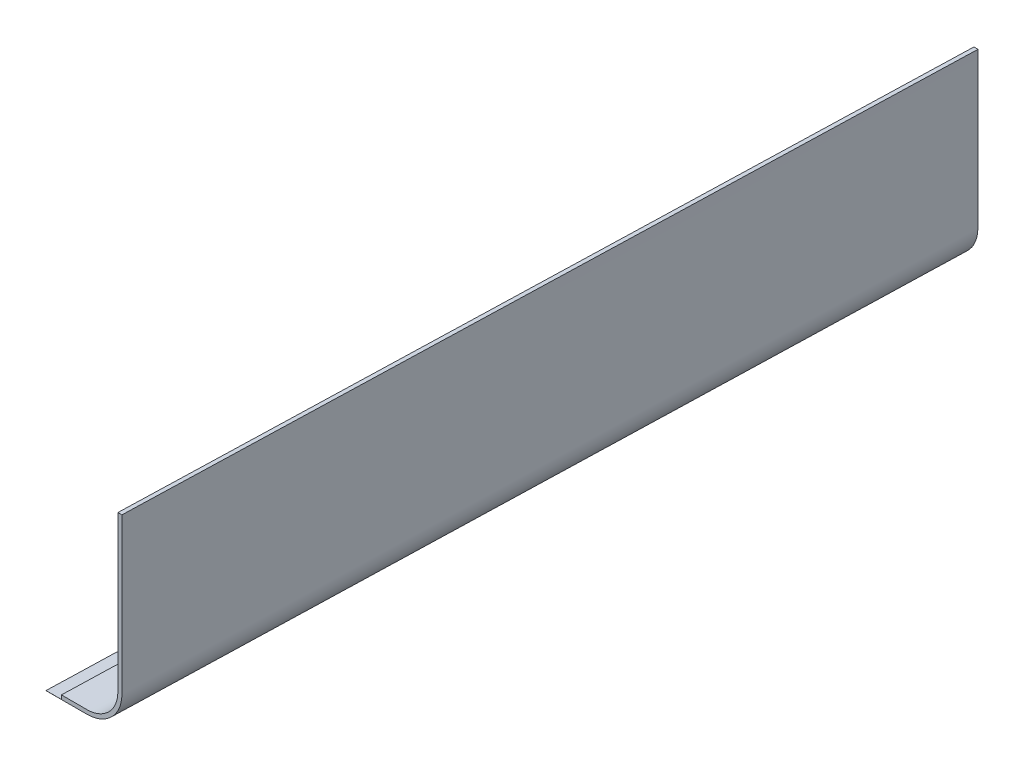
ISO-10303-21;
HEADER;
FILE_DESCRIPTION(('STEP AP214'),'2;1');
FILE_NAME('part.step','',(''),(''),'','','');
FILE_SCHEMA(('AUTOMOTIVE_DESIGN { 1 0 10303 214 1 1 1 1 }'));
ENDSEC;
DATA;
#1=APPLICATION_CONTEXT('core data for automotive mechanical design processes');
#2=APPLICATION_PROTOCOL_DEFINITION('international standard','automotive_design',2000,#1);
#3=PRODUCT_CONTEXT('',#1,'mechanical');
#4=PRODUCT('Part','Part','',(#3));
#5=PRODUCT_RELATED_PRODUCT_CATEGORY('part','',(#4));
#6=PRODUCT_DEFINITION_FORMATION('','',#4);
#7=PRODUCT_DEFINITION_CONTEXT('part definition',#1,'design');
#8=PRODUCT_DEFINITION('design','',#6,#7);
#9=PRODUCT_DEFINITION_SHAPE('','',#8);
#10=(LENGTH_UNIT() NAMED_UNIT(*) SI_UNIT(.MILLI.,.METRE.));
#11=(NAMED_UNIT(*) PLANE_ANGLE_UNIT() SI_UNIT($,.RADIAN.));
#12=(NAMED_UNIT(*) SI_UNIT($,.STERADIAN.) SOLID_ANGLE_UNIT());
#13=UNCERTAINTY_MEASURE_WITH_UNIT(LENGTH_MEASURE(1.E-05),#10,'distance_accuracy_value','');
#14=(GEOMETRIC_REPRESENTATION_CONTEXT(3) GLOBAL_UNCERTAINTY_ASSIGNED_CONTEXT((#13)) GLOBAL_UNIT_ASSIGNED_CONTEXT((#10,
#11,#12)) REPRESENTATION_CONTEXT('',''));
#15=CARTESIAN_POINT('',(0.,0.,0.));
#16=DIRECTION('',(0.,0.,1.));
#17=DIRECTION('',(1.,0.,0.));
#18=AXIS2_PLACEMENT_3D('',#15,#16,#17);
#19=CARTESIAN_POINT('',(444.552202442193,-229.69048438311,-2052.91158045471));
#20=DIRECTION('',(0.,0.,-1.));
#21=DIRECTION('',(-1.,0.,0.));
#22=AXIS2_PLACEMENT_3D('',#19,#20,#21);
#23=PLANE('',#22);
#24=CARTESIAN_POINT('',(444.552202442193,-229.69048438311,-2052.91158045471));
#25=DIRECTION('',(0.,0.,-1.));
#26=DIRECTION('',(-1.,0.,0.));
#27=AXIS2_PLACEMENT_3D('',#24,#25,#26);
#28=CIRCLE('',#27,76.2);
#29=CARTESIAN_POINT('',(520.752202442193,-229.69048438311,-2052.91158045471));
#30=VERTEX_POINT('',#29);
#31=CARTESIAN_POINT('',(444.552202442193,-305.89048438311,-2052.91158045471));
#32=VERTEX_POINT('',#31);
#33=EDGE_CURVE('E407',#30,#32,#28,.T.);
#34=ORIENTED_EDGE('',*,*,#33,.F.);
#35=DIRECTION('',(0.,1.,0.));
#36=VECTOR('',#35,1.);
#37=CARTESIAN_POINT('',(520.752202442193,-229.69048438311,-2052.91158045471));
#38=LINE('',#37,#36);
#39=CARTESIAN_POINT('',(520.775302184779,119.559497264368,-2052.91158045471));
#40=VERTEX_POINT('',#39);
#41=EDGE_CURVE('E13',#30,#40,#38,.T.);
#42=ORIENTED_EDGE('',*,*,#41,.T.);
#43=DIRECTION('',(0.00914316205582928,0.999958200420208,0.));
#44=VECTOR('',#43,1.);
#45=CARTESIAN_POINT('',(520.752202442193,119.55951561689,-2052.91158045471));
#46=LINE('',#45,#44);
#47=CARTESIAN_POINT('',(521.055748406601,152.757360570469,-2052.91158045471));
#48=VERTEX_POINT('',#47);
#49=EDGE_CURVE('E296',#40,#48,#46,.T.);
#50=ORIENTED_EDGE('',*,*,#49,.T.);
#51=DIRECTION('',(0.999958200420208,-0.00914316205583025,0.));
#52=VECTOR('',#51,1.);
#53=CARTESIAN_POINT('',(521.055748406601,152.757360570469,-2052.91158045471));
#54=LINE('',#53,#52);
#55=CARTESIAN_POINT('',(531.055330410803,152.665928949911,-2052.91158045471));
#56=VERTEX_POINT('',#55);
#57=EDGE_CURVE('E728',#48,#56,#54,.T.);
#58=ORIENTED_EDGE('',*,*,#57,.T.);
#59=DIRECTION('',(0.00914316205582929,0.999958200420208,0.));
#60=VECTOR('',#59,1.);
#61=CARTESIAN_POINT('',(530.752202442193,119.513798851146,-2052.91158045471));
#62=LINE('',#61,#60);
#63=CARTESIAN_POINT('',(530.775272871336,119.513780556922,-2052.91158045471));
#64=VERTEX_POINT('',#63);
#65=EDGE_CURVE('E405',#64,#56,#62,.T.);
#66=ORIENTED_EDGE('',*,*,#65,.F.);
#67=DIRECTION('',(0.,1.,0.));
#68=VECTOR('',#67,1.);
#69=CARTESIAN_POINT('',(530.752202442193,-229.69048438311,-2052.91158045471));
#70=LINE('',#69,#68);
#71=CARTESIAN_POINT('',(530.752202442193,-229.69048438311,-2052.91158045471));
#72=VERTEX_POINT('',#71);
#73=EDGE_CURVE('E723',#72,#64,#70,.T.);
#74=ORIENTED_EDGE('',*,*,#73,.F.);
#75=CARTESIAN_POINT('',(444.552202442193,-229.69048438311,-2052.91158045471));
#76=DIRECTION('',(0.,0.,-1.));
#77=DIRECTION('',(-1.,0.,0.));
#78=AXIS2_PLACEMENT_3D('',#75,#76,#77);
#79=CIRCLE('',#78,86.2000000000001);
#80=CARTESIAN_POINT('',(444.552202442193,-315.89048438311,-2052.91158045471));
#81=VERTEX_POINT('',#80);
#82=EDGE_CURVE('E720',#72,#81,#79,.T.);
#83=ORIENTED_EDGE('',*,*,#82,.T.);
#84=DIRECTION('',(1.,0.,0.));
#85=VECTOR('',#84,1.);
#86=CARTESIAN_POINT('',(343.440050678528,-315.89048438311,-2052.91158045471));
#87=LINE('',#86,#85);
#88=CARTESIAN_POINT('',(343.440050678528,-315.89048438311,-2052.91158045471));
#89=VERTEX_POINT('',#88);
#90=EDGE_CURVE('E488',#89,#81,#87,.T.);
#91=ORIENTED_EDGE('',*,*,#90,.F.);
#92=DIRECTION('',(0.,1.,0.));
#93=VECTOR('',#92,1.);
#94=CARTESIAN_POINT('',(343.440050678528,-315.89048438311,-2052.91158045471));
#95=LINE('',#94,#93);
#96=CARTESIAN_POINT('',(343.440050678528,-315.69048438311,-2052.91158045471));
#97=VERTEX_POINT('',#96);
#98=EDGE_CURVE('E715',#89,#97,#95,.T.);
#99=ORIENTED_EDGE('',*,*,#98,.T.);
#100=DIRECTION('',(1.,0.,0.));
#101=VECTOR('',#100,1.);
#102=CARTESIAN_POINT('',(343.440050678528,-315.69048438311,-2052.91158045471));
#103=LINE('',#102,#101);
#104=CARTESIAN_POINT('',(381.540050678528,-315.69048438311,-2052.91158045471));
#105=VERTEX_POINT('',#104);
#106=EDGE_CURVE('E712',#97,#105,#103,.T.);
#107=ORIENTED_EDGE('',*,*,#106,.T.);
#108=DIRECTION('',(0.,-1.,0.));
#109=VECTOR('',#108,1.);
#110=CARTESIAN_POINT('',(381.540050678528,-305.89048438311,-2052.91158045471));
#111=LINE('',#110,#109);
#112=CARTESIAN_POINT('',(381.540050678528,-305.89048438311,-2052.91158045471));
#113=VERTEX_POINT('',#112);
#114=EDGE_CURVE('E310',#113,#105,#111,.T.);
#115=ORIENTED_EDGE('',*,*,#114,.F.);
#116=DIRECTION('',(1.,0.,0.));
#117=VECTOR('',#116,1.);
#118=CARTESIAN_POINT('',(381.540050678528,-305.89048438311,-2052.91158045471));
#119=LINE('',#118,#117);
#120=EDGE_CURVE('E304',#113,#32,#119,.T.);
#121=ORIENTED_EDGE('',*,*,#120,.T.);
#122=EDGE_LOOP('',(#34,#42,#50,#58,#66,#74,#83,#91,#99,#107,#115,#121));
#123=FACE_BOUND('',#122,.T.);
#124=ADVANCED_FACE('F285',(#123),#23,.T.);
#125=CARTESIAN_POINT('',(383.521789204401,-230.782639429518,0.));
#126=DIRECTION('',(0.,0.,1.));
#127=DIRECTION('',(1.,0.,0.));
#128=AXIS2_PLACEMENT_3D('',#125,#126,#127);
#129=PLANE('',#128);
#130=DIRECTION('',(1.,0.,0.));
#131=VECTOR('',#130,1.);
#132=CARTESIAN_POINT('',(459.721789204401,152.757360570421,0.));
#133=LINE('',#132,#131);
#134=CARTESIAN_POINT('',(459.721789204401,152.757360570421,0.));
#135=VERTEX_POINT('',#134);
#136=CARTESIAN_POINT('',(469.721789204401,152.757360570421,0.));
#137=VERTEX_POINT('',#136);
#138=EDGE_CURVE('E379',#135,#137,#133,.T.);
#139=ORIENTED_EDGE('',*,*,#138,.F.);
#140=DIRECTION('',(0.,-1.,0.));
#141=VECTOR('',#140,1.);
#142=CARTESIAN_POINT('',(459.721789204401,152.757360570421,0.));
#143=LINE('',#142,#141);
#144=CARTESIAN_POINT('',(459.721789204401,-230.782639429518,0.));
#145=VERTEX_POINT('',#144);
#146=EDGE_CURVE('E521',#135,#145,#143,.T.);
#147=ORIENTED_EDGE('',*,*,#146,.T.);
#148=CARTESIAN_POINT('',(383.521789204401,-230.782639429518,0.));
#149=DIRECTION('',(0.,0.,1.));
#150=DIRECTION('',(1.,0.,0.));
#151=AXIS2_PLACEMENT_3D('',#148,#149,#150);
#152=CIRCLE('',#151,76.2);
#153=CARTESIAN_POINT('',(383.521789204401,-306.982639429518,0.));
#154=VERTEX_POINT('',#153);
#155=EDGE_CURVE('E525',#154,#145,#152,.T.);
#156=ORIENTED_EDGE('',*,*,#155,.F.);
#157=DIRECTION('',(1.,0.,0.));
#158=VECTOR('',#157,1.);
#159=CARTESIAN_POINT('',(320.329495069525,-306.982639429518,0.));
#160=LINE('',#159,#158);
#161=CARTESIAN_POINT('',(320.329495069525,-306.982639429518,0.));
#162=VERTEX_POINT('',#161);
#163=EDGE_CURVE('E543',#162,#154,#160,.T.);
#164=ORIENTED_EDGE('',*,*,#163,.F.);
#165=DIRECTION('',(0.,1.,0.));
#166=VECTOR('',#165,1.);
#167=CARTESIAN_POINT('',(320.329495069525,-316.782639429518,0.));
#168=LINE('',#167,#166);
#169=CARTESIAN_POINT('',(320.329495069525,-316.782639429518,0.));
#170=VERTEX_POINT('',#169);
#171=EDGE_CURVE('E546',#170,#162,#168,.T.);
#172=ORIENTED_EDGE('',*,*,#171,.F.);
#173=DIRECTION('',(1.,0.,0.));
#174=VECTOR('',#173,1.);
#175=CARTESIAN_POINT('',(282.229495069525,-316.782639429518,0.));
#176=LINE('',#175,#174);
#177=CARTESIAN_POINT('',(282.229495069525,-316.782639429518,0.));
#178=VERTEX_POINT('',#177);
#179=EDGE_CURVE('E564',#178,#170,#176,.T.);
#180=ORIENTED_EDGE('',*,*,#179,.F.);
#181=DIRECTION('',(0.,1.,0.));
#182=VECTOR('',#181,1.);
#183=CARTESIAN_POINT('',(282.229495069525,-316.982639429518,0.));
#184=LINE('',#183,#182);
#185=CARTESIAN_POINT('',(282.229495069525,-316.982639429518,0.));
#186=VERTEX_POINT('',#185);
#187=EDGE_CURVE('E567',#186,#178,#184,.T.);
#188=ORIENTED_EDGE('',*,*,#187,.F.);
#189=DIRECTION('',(-1.,0.,0.));
#190=VECTOR('',#189,1.);
#191=CARTESIAN_POINT('',(320.329495069525,-316.982639429518,0.));
#192=LINE('',#191,#190);
#193=CARTESIAN_POINT('',(320.329495069525,-316.982639429518,0.));
#194=VERTEX_POINT('',#193);
#195=EDGE_CURVE('E585',#194,#186,#192,.T.);
#196=ORIENTED_EDGE('',*,*,#195,.F.);
#197=DIRECTION('',(1.,0.,0.));
#198=VECTOR('',#197,1.);
#199=CARTESIAN_POINT('',(320.329495069525,-316.982639429518,0.));
#200=LINE('',#199,#198);
#201=CARTESIAN_POINT('',(383.521789204401,-316.982639429518,0.));
#202=VERTEX_POINT('',#201);
#203=EDGE_CURVE('E588',#194,#202,#200,.T.);
#204=ORIENTED_EDGE('',*,*,#203,.T.);
#205=CARTESIAN_POINT('',(383.521789204401,-230.782639429518,0.));
#206=DIRECTION('',(0.,0.,1.));
#207=DIRECTION('',(1.,0.,0.));
#208=AXIS2_PLACEMENT_3D('',#205,#206,#207);
#209=CIRCLE('',#208,86.2);
#210=CARTESIAN_POINT('',(469.721789204401,-230.782639429518,0.));
#211=VERTEX_POINT('',#210);
#212=EDGE_CURVE('E382',#202,#211,#209,.T.);
#213=ORIENTED_EDGE('',*,*,#212,.T.);
#214=DIRECTION('',(0.,-1.,0.));
#215=VECTOR('',#214,1.);
#216=CARTESIAN_POINT('',(469.721789204401,152.757360570421,0.));
#217=LINE('',#216,#215);
#218=EDGE_CURVE('E375',#137,#211,#217,.T.);
#219=ORIENTED_EDGE('',*,*,#218,.F.);
#220=EDGE_LOOP('',(#139,#147,#156,#164,#172,#180,#188,#196,#204,#213,#219));
#221=FACE_BOUND('',#220,.T.);
#222=ADVANCED_FACE('F378',(#221),#129,.T.);
#223=CARTESIAN_POINT('',(459.721789204401,152.757360570421,0.));
#224=CARTESIAN_POINT('',(480.166442271801,152.757360570437,-684.303860151571));
#225=CARTESIAN_POINT('',(500.611095339201,152.757360570453,-1368.60772030314));
#226=CARTESIAN_POINT('',(521.055748406601,152.757360570469,-2052.91158045471));
#227=CARTESIAN_POINT('',(460.555122537734,152.75736057042,0.));
#228=CARTESIAN_POINT('',(480.99976399414,152.754820803199,-684.303860151571));
#229=CARTESIAN_POINT('',(501.444405450546,152.752281035977,-1368.60772030314));
#230=CARTESIAN_POINT('',(521.889046906951,152.749741268756,-2052.91158045471));
#231=CARTESIAN_POINT('',(462.221789204401,152.757360570421,0.));
#232=CARTESIAN_POINT('',(482.666407438818,152.749741268724,-684.303860151571));
#233=CARTESIAN_POINT('',(503.111025673235,152.742121967027,-1368.60772030314));
#234=CARTESIAN_POINT('',(523.555643907652,152.73450266533,-2052.91158045471));
#235=CARTESIAN_POINT('',(464.721789204401,152.75736057042,0.));
#236=CARTESIAN_POINT('',(485.166372605835,152.74212196701,-684.303860151571));
#237=CARTESIAN_POINT('',(505.610956007268,152.7268833636,-1368.60772030314));
#238=CARTESIAN_POINT('',(526.055539408702,152.71164476019,-2052.91158045471));
#239=CARTESIAN_POINT('',(467.221789204401,152.757360570421,0.));
#240=CARTESIAN_POINT('',(487.666337772852,152.734502665297,-684.303860151571));
#241=CARTESIAN_POINT('',(508.110886341302,152.711644760174,-1368.60772030314));
#242=CARTESIAN_POINT('',(528.555434909753,152.68878685505,-2052.91158045471));
#243=CARTESIAN_POINT('',(468.888455871068,152.75736057042,0.));
#244=CARTESIAN_POINT('',(489.33298121753,152.729423130822,-684.303860151571));
#245=CARTESIAN_POINT('',(509.777506563991,152.701485691223,-1368.60772030314));
#246=CARTESIAN_POINT('',(530.222031910453,152.673548251624,-2052.91158045471));
#247=CARTESIAN_POINT('',(469.721789204401,152.757360570421,0.));
#248=CARTESIAN_POINT('',(490.166302939869,152.726883363584,-684.303860151571));
#249=CARTESIAN_POINT('',(510.610816675336,152.696406156747,-1368.60772030314));
#250=CARTESIAN_POINT('',(531.055330410803,152.665928949911,-2052.91158045471));
#251=B_SPLINE_SURFACE_WITH_KNOTS('',3,3,((#223,#224,#225,#226),(#227,#228,#229,#230),(#231,#232,
#233,#234),(#235,#236,#237,#238),(#239,#240,#241,#242),(#243,#244,#245,#246),(#247,#248,#249,
#250)),.UNSPECIFIED.,.F.,.F.,.F.,(4,1,1,1,4),(4,4),(0.99195781967235,0.993968364754263,
0.995978909836175,0.997989454918088,1.),(0.,1.),.UNSPECIFIED.);
#252=CARTESIAN_POINT('',(469.721789204401,152.757360570421,0.));
#253=CARTESIAN_POINT('',(490.166302939869,152.726883363584,-684.303860151571));
#254=CARTESIAN_POINT('',(510.610816675336,152.696406156747,-1368.60772030314));
#255=CARTESIAN_POINT('',(531.055330410803,152.665928949911,-2052.91158045471));
#256=B_SPLINE_CURVE_WITH_KNOTS('',3,(#252,#253,#254,#255),.UNSPECIFIED.,.F.,.F.,(4,4),(0.,1.),.UNSPECIFIED.);
#257=EDGE_CURVE('E395',#137,#56,#256,.T.);
#258=CARTESIAN_POINT('',(459.721789204401,152.757360570421,0.));
#259=CARTESIAN_POINT('',(480.166442271801,152.757360570437,-684.303860151571));
#260=CARTESIAN_POINT('',(500.611095339201,152.757360570453,-1368.60772030314));
#261=CARTESIAN_POINT('',(521.055748406601,152.757360570469,-2052.91158045471));
#262=B_SPLINE_CURVE_WITH_KNOTS('',3,(#258,#259,#260,#261),.UNSPECIFIED.,.F.,.F.,(4,4),(0.,1.),.UNSPECIFIED.);
#263=EDGE_CURVE('E397',#135,#48,#262,.T.);
#264=ORIENTED_EDGE('',*,*,#138,.T.);
#265=ORIENTED_EDGE('',*,*,#257,.T.);
#266=ORIENTED_EDGE('',*,*,#57,.F.);
#267=ORIENTED_EDGE('',*,*,#263,.F.);
#268=EDGE_LOOP('',(#264,#265,#266,#267));
#269=FACE_BOUND('',#268,.T.);
#270=ADVANCED_FACE('F393',(#269),#251,.T.);
#271=CARTESIAN_POINT('',(320.329495069525,-306.982639429518,0.));
#272=CARTESIAN_POINT('',(340.733013605859,-306.618587747382,-684.303860151571));
#273=CARTESIAN_POINT('',(361.136532142194,-306.254536065246,-1368.60772030314));
#274=CARTESIAN_POINT('',(381.540050678528,-305.89048438311,-2052.91158045471));
#275=CARTESIAN_POINT('',(325.550678712464,-306.982639429518,0.));
#276=CARTESIAN_POINT('',(345.979055586448,-306.618587747382,-684.303860151571));
#277=CARTESIAN_POINT('',(366.407432460432,-306.254536065246,-1368.60772030314));
#278=CARTESIAN_POINT('',(386.835809334416,-305.89048438311,-2052.91158045471));
#279=CARTESIAN_POINT('',(336.039639117235,-306.982639429518,0.));
#280=CARTESIAN_POINT('',(356.486233632602,-306.618587747382,-684.303860151571));
#281=CARTESIAN_POINT('',(376.93282814797,-306.254536065246,-1368.60772030314));
#282=CARTESIAN_POINT('',(397.379422663338,-305.89048438311,-2052.91158045471));
#283=CARTESIAN_POINT('',(351.85991993826,-306.982639429518,0.));
#284=CARTESIAN_POINT('',(372.276623963665,-306.618587747382,-684.303860151571));
#285=CARTESIAN_POINT('',(392.693327989069,-306.254536065246,-1368.60772030314));
#286=CARTESIAN_POINT('',(413.110032014474,-305.890484383109,-2052.91158045471));
#287=CARTESIAN_POINT('',(367.710949607846,-306.982639429518,0.));
#288=CARTESIAN_POINT('',(388.07781173544,-306.618587747382,-684.303860151571));
#289=CARTESIAN_POINT('',(408.444673863035,-306.254536065246,-1368.60772030314));
#290=CARTESIAN_POINT('',(428.81153599063,-305.89048438311,-2052.91158045471));
#291=CARTESIAN_POINT('',(378.260684754143,-306.982639429518,0.));
#292=CARTESIAN_POINT('',(398.605883216917,-306.618587747382,-684.303860151571));
#293=CARTESIAN_POINT('',(418.951081679692,-306.254536065246,-1368.60772030314));
#294=CARTESIAN_POINT('',(439.296280142466,-305.89048438311,-2052.91158045471));
#295=CARTESIAN_POINT('',(388.511527539999,-306.982639429518,0.));
#296=CARTESIAN_POINT('',(408.853360333651,-306.618587747382,-684.303860151571));
#297=CARTESIAN_POINT('',(429.195193127303,-306.254536065246,-1368.60772030314));
#298=CARTESIAN_POINT('',(449.537025920955,-305.89048438311,-2052.91158045471));
#299=CARTESIAN_POINT('',(398.488288635919,-305.99960007623,0.));
#300=CARTESIAN_POINT('',(418.82857298511,-305.636164400267,-684.303860151572));
#301=CARTESIAN_POINT('',(439.168857334301,-305.272728724305,-1368.60772030314));
#302=CARTESIAN_POINT('',(459.509141683492,-304.909293048342,-2052.91158045472));
#303=CARTESIAN_POINT('',(412.872903106114,-301.634794773295,0.));
#304=CARTESIAN_POINT('',(433.214645151296,-301.271648709871,-684.303860151571));
#305=CARTESIAN_POINT('',(453.556387196479,-300.908502646447,-1368.60772030314));
#306=CARTESIAN_POINT('',(473.898129241661,-300.545356583022,-2052.91158045471));
#307=CARTESIAN_POINT('',(426.127053955248,-294.550170818105,0.));
#308=CARTESIAN_POINT('',(446.47197693143,-294.185475641663,-684.303860151571));
#309=CARTESIAN_POINT('',(466.816899907611,-293.820780465222,-1368.60772030314));
#310=CARTESIAN_POINT('',(487.161822883793,-293.45608528878,-2052.91158045471));
#311=CARTESIAN_POINT('',(437.744292886715,-285.017487182193,0.));
#312=CARTESIAN_POINT('',(458.092075778492,-284.649510253963,-684.303860151571));
#313=CARTESIAN_POINT('',(478.439858670269,-284.281533325734,-1368.60772030314));
#314=CARTESIAN_POINT('',(498.787641562046,-283.913556397505,-2052.91158045471));
#315=CARTESIAN_POINT('',(447.280329472288,-273.401609659785,0.));
#316=CARTESIAN_POINT('',(467.629155039194,-273.029865002327,-684.30386015157));
#317=CARTESIAN_POINT('',(487.977980606101,-272.658120344868,-1368.60772030314));
#318=CARTESIAN_POINT('',(508.326806173008,-272.28637568741,-2052.91158045471));
#319=CARTESIAN_POINT('',(454.36915331995,-260.14604578772,0.));
#320=CARTESIAN_POINT('',(474.716724075819,-259.772066372182,-684.303860151573));
#321=CARTESIAN_POINT('',(495.064294831687,-259.398086956643,-1368.60772030315));
#322=CARTESIAN_POINT('',(515.411865587555,-259.024107541105,-2052.91158045472));
#323=CARTESIAN_POINT('',(458.737629648789,-245.756921325098,0.));
#324=CARTESIAN_POINT('',(479.082462362654,-245.384496388962,-684.30386015157));
#325=CARTESIAN_POINT('',(499.42729507652,-245.012071452827,-1368.60772030314));
#326=CARTESIAN_POINT('',(519.772127790385,-244.639646516691,-2052.91158045471));
#327=CARTESIAN_POINT('',(459.721789204401,-235.775214440323,0.));
#328=CARTESIAN_POINT('',(480.065260283665,-235.407635356068,-684.303860151571));
#329=CARTESIAN_POINT('',(500.408731362929,-235.040056271814,-1368.60772030314));
#330=CARTESIAN_POINT('',(520.752202442193,-234.672477187559,-2052.91158045471));
#331=CARTESIAN_POINT('',(459.721789204401,-201.606059407567,0.));
#332=CARTESIAN_POINT('',(480.065260283665,-201.262621843387,-684.303860151571));
#333=CARTESIAN_POINT('',(500.408731362929,-200.919184279206,-1368.60772030314));
#334=CARTESIAN_POINT('',(520.752202442193,-200.575746715026,-2052.91158045471));
#335=CARTESIAN_POINT('',(459.721789204401,-143.242312622474,0.));
#336=CARTESIAN_POINT('',(480.065260283665,-142.947158094973,-684.303860151571));
#337=CARTESIAN_POINT('',(500.408731362929,-142.652003567472,-1368.60772030314));
#338=CARTESIAN_POINT('',(520.752202442193,-142.356849039971,-2052.91158045471));
#339=CARTESIAN_POINT('',(459.721789204401,-55.6768216910397,0.));
#340=CARTESIAN_POINT('',(480.065260283665,-55.467319478478,-684.303860151571));
#341=CARTESIAN_POINT('',(500.408731362929,-55.2578172659163,-1368.60772030314));
#342=CARTESIAN_POINT('',(520.752202442192,-55.0483150533547,-2052.91158045471));
#343=CARTESIAN_POINT('',(459.721789204401,31.8966223620084,0.));
#344=CARTESIAN_POINT('',(480.065260283665,32.015181147921,-684.303860151571));
#345=CARTESIAN_POINT('',(500.408731362929,32.1337399338337,-1368.60772030314));
#346=CARTESIAN_POINT('',(520.752202442193,32.2522987197463,-2052.91158045471));
#347=CARTESIAN_POINT('',(459.721789204401,90.2762683376779,0.));
#348=CARTESIAN_POINT('',(480.065260283665,90.3359618751932,-684.303860151571));
#349=CARTESIAN_POINT('',(500.408731362929,90.3956554127084,-1368.60772030314));
#350=CARTESIAN_POINT('',(520.752202442193,90.4553489502237,-2052.91158045471));
#351=CARTESIAN_POINT('',(459.721789204401,122.237935004339,0.));
#352=CARTESIAN_POINT('',(480.07369211601,122.267290901678,-684.303860151571));
#353=CARTESIAN_POINT('',(500.425595027618,122.296646799017,-1368.60772030314));
#354=CARTESIAN_POINT('',(520.777497939227,122.326002696355,-2052.91158045471));
#355=CARTESIAN_POINT('',(459.721789204402,127.787378277302,0.));
#356=CARTESIAN_POINT('',(480.090554392569,127.811092654613,-684.30386015157));
#357=CARTESIAN_POINT('',(500.459319580736,127.834807031924,-1368.60772030314));
#358=CARTESIAN_POINT('',(520.828084768903,127.858521409235,-2052.91158045471));
#359=CARTESIAN_POINT('',(459.721789204401,136.111885850788,0.));
#360=CARTESIAN_POINT('',(480.115846766489,136.126909884864,-684.303860151572));
#361=CARTESIAN_POINT('',(500.509904328577,136.141933918939,-1368.60772030314));
#362=CARTESIAN_POINT('',(520.903961890666,136.156957953015,-2052.91158045472));
#363=CARTESIAN_POINT('',(459.721789204402,144.435707866162,0.));
#364=CARTESIAN_POINT('',(480.141141221547,144.44249768366,-684.30386015157));
#365=CARTESIAN_POINT('',(500.560493238693,144.449287501157,-1368.60772030314));
#366=CARTESIAN_POINT('',(520.979845255839,144.456077318655,-2052.91158045471));
#367=CARTESIAN_POINT('',(459.721789204401,149.983780574189,0.));
#368=CARTESIAN_POINT('',(480.158007662053,149.985841124116,-684.303860151571));
#369=CARTESIAN_POINT('',(500.594226119705,149.987901674044,-1368.60772030314));
#370=CARTESIAN_POINT('',(521.030444577357,149.989962223971,-2052.91158045471));
#371=CARTESIAN_POINT('',(459.721789204401,152.757360570421,0.));
#372=CARTESIAN_POINT('',(480.166442271801,152.757360570437,-684.303860151571));
#373=CARTESIAN_POINT('',(500.611095339201,152.757360570453,-1368.60772030314));
#374=CARTESIAN_POINT('',(521.055748406601,152.757360570469,-2052.91158045471));
#375=B_SPLINE_SURFACE_WITH_KNOTS('',3,3,((#271,#272,#273,#274),(#275,#276,#277,#278),(#279,#280,
#281,#282),(#283,#284,#285,#286),(#287,#288,#289,#290),(#291,#292,#293,#294),(#295,#296,#297,
#298),(#299,#300,#301,#302),(#303,#304,#305,#306),(#307,#308,#309,#310),(#311,#312,#313,#314),
(#315,#316,#317,#318),(#319,#320,#321,#322),(#323,#324,#325,#326),(#327,#328,#329,#330),(#331,
#332,#333,#334),(#335,#336,#337,#338),(#339,#340,#341,#342),(#343,#344,#345,#346),(#347,#348,
#349,#350),(#351,#352,#353,#354),(#355,#356,#357,#358),(#359,#360,#361,#362),(#363,#364,#365,
#366),(#367,#368,#369,#370),(#371,#372,#373,#374)),.UNSPECIFIED.,.F.,.F.,.F.,(4,1,1,1,2,1,1,1,1,
1,1,1,2,1,1,1,2,1,1,1,4),(4,4),(0.536938618118648,0.549625585344477,0.562312552570307,
0.574999519796136,0.587686487021966,0.599719064542451,0.611751642062935,0.62378421958342,
0.635816797103904,0.647849374624389,0.659881952144874,0.671914529665358,0.683947107185843,
0.754265421453073,0.824583735720304,0.894902049987534,0.965220364254765,0.971904728109161,
0.978589091963558,0.985273455817954,0.99195781967235),(0.,1.),.UNSPECIFIED.);
#376=CARTESIAN_POINT('',(320.329495069525,-306.982639429518,0.));
#377=CARTESIAN_POINT('',(340.733013605859,-306.618587747382,-684.303860151571));
#378=CARTESIAN_POINT('',(361.136532142194,-306.254536065246,-1368.60772030314));
#379=CARTESIAN_POINT('',(381.540050678528,-305.89048438311,-2052.91158045471));
#380=B_SPLINE_CURVE_WITH_KNOTS('',3,(#376,#377,#378,#379),.UNSPECIFIED.,.F.,.F.,(4,4),(0.,1.),.UNSPECIFIED.);
#381=EDGE_CURVE('E410',#162,#113,#380,.T.);
#382=ORIENTED_EDGE('',*,*,#163,.T.);
#383=ORIENTED_EDGE('',*,*,#155,.T.);
#384=ORIENTED_EDGE('',*,*,#146,.F.);
#385=ORIENTED_EDGE('',*,*,#263,.T.);
#386=ORIENTED_EDGE('',*,*,#49,.F.);
#387=ORIENTED_EDGE('',*,*,#41,.F.);
#388=ORIENTED_EDGE('',*,*,#33,.T.);
#389=ORIENTED_EDGE('',*,*,#120,.F.);
#390=ORIENTED_EDGE('',*,*,#381,.F.);
#391=EDGE_LOOP('',(#382,#383,#384,#385,#386,#387,#388,#389,#390));
#392=FACE_BOUND('',#391,.T.);
#393=ADVANCED_FACE('F440',(#392),#375,.T.);
#394=CARTESIAN_POINT('',(320.329495069525,-316.782639429518,0.));
#395=DIRECTION('',(-0.999555785527689,0.,-0.0298032148957882));
#396=DIRECTION('',(0.,1.,0.));
#397=AXIS2_PLACEMENT_3D('',#394,#395,#396);
#398=PLANE('',#397);
#399=ORIENTED_EDGE('',*,*,#171,.T.);
#400=ORIENTED_EDGE('',*,*,#381,.T.);
#401=ORIENTED_EDGE('',*,*,#114,.T.);
#402=CARTESIAN_POINT('',(320.329495069525,-316.782639429518,0.));
#403=CARTESIAN_POINT('',(340.733013605859,-316.418587747382,-684.303860151571));
#404=CARTESIAN_POINT('',(361.136532142194,-316.054536065246,-1368.60772030314));
#405=CARTESIAN_POINT('',(381.540050678528,-315.69048438311,-2052.91158045471));
#406=B_SPLINE_CURVE_WITH_KNOTS('',3,(#402,#403,#404,#405),.UNSPECIFIED.,.F.,.F.,(4,4),(0.,1.),.UNSPECIFIED.);
#407=EDGE_CURVE('E739',#170,#105,#406,.T.);
#408=ORIENTED_EDGE('',*,*,#407,.F.);
#409=EDGE_LOOP('',(#399,#400,#401,#408));
#410=FACE_BOUND('',#409,.T.);
#411=ADVANCED_FACE('F644',(#410),#398,.T.);
#412=CARTESIAN_POINT('',(282.229495069525,-316.782639429518,0.));
#413=DIRECTION('',(0.,0.999999858486453,0.000532002889092604));
#414=DIRECTION('',(1.,0.,0.));
#415=AXIS2_PLACEMENT_3D('',#412,#413,#414);
#416=PLANE('',#415);
#417=ORIENTED_EDGE('',*,*,#179,.T.);
#418=ORIENTED_EDGE('',*,*,#407,.T.);
#419=ORIENTED_EDGE('',*,*,#106,.F.);
#420=CARTESIAN_POINT('',(282.229495069525,-316.782639429518,0.));
#421=CARTESIAN_POINT('',(302.633013605859,-316.418587747382,-684.303860151571));
#422=CARTESIAN_POINT('',(323.036532142194,-316.054536065246,-1368.60772030314));
#423=CARTESIAN_POINT('',(343.440050678528,-315.69048438311,-2052.91158045471));
#424=B_SPLINE_CURVE_WITH_KNOTS('',3,(#420,#421,#422,#423),.UNSPECIFIED.,.F.,.F.,(4,4),(0.,1.),.UNSPECIFIED.);
#425=EDGE_CURVE('E737',#178,#97,#424,.T.);
#426=ORIENTED_EDGE('',*,*,#425,.F.);
#427=EDGE_LOOP('',(#417,#418,#419,#426));
#428=FACE_BOUND('',#427,.T.);
#429=ADVANCED_FACE('F846',(#428),#416,.T.);
#430=CARTESIAN_POINT('',(282.229495069525,-316.982639429518,0.));
#431=DIRECTION('',(-0.999555785527689,-2.77432461872485E-13,-0.0298032148957884));
#432=DIRECTION('',(-2.77555756156243E-13,1.,0.));
#433=AXIS2_PLACEMENT_3D('',#430,#431,#432);
#434=PLANE('',#433);
#435=ORIENTED_EDGE('',*,*,#187,.T.);
#436=ORIENTED_EDGE('',*,*,#425,.T.);
#437=ORIENTED_EDGE('',*,*,#98,.F.);
#438=CARTESIAN_POINT('',(282.229495069525,-316.982639429518,0.));
#439=CARTESIAN_POINT('',(302.633013605859,-316.618587747382,-684.303860151571));
#440=CARTESIAN_POINT('',(323.036532142194,-316.254536065246,-1368.60772030314));
#441=CARTESIAN_POINT('',(343.440050678528,-315.89048438311,-2052.91158045471));
#442=B_SPLINE_CURVE_WITH_KNOTS('',3,(#438,#439,#440,#441),.UNSPECIFIED.,.F.,.F.,(4,4),(0.,1.),.UNSPECIFIED.);
#443=EDGE_CURVE('E524',#186,#89,#442,.T.);
#444=ORIENTED_EDGE('',*,*,#443,.F.);
#445=EDGE_LOOP('',(#435,#436,#437,#444));
#446=FACE_BOUND('',#445,.T.);
#447=ADVANCED_FACE('F287',(#446),#434,.T.);
#448=CARTESIAN_POINT('',(469.721789204401,152.757360570421,0.));
#449=CARTESIAN_POINT('',(490.166302939869,152.726883363584,-684.303860151571));
#450=CARTESIAN_POINT('',(510.610816675336,152.696406156747,-1368.60772030314));
#451=CARTESIAN_POINT('',(531.055330410803,152.665928949911,-2052.91158045471));
#452=CARTESIAN_POINT('',(469.721789204401,149.987014999247,0.));
#453=CARTESIAN_POINT('',(490.157879708816,149.958764651901,-684.303860151571));
#454=CARTESIAN_POINT('',(510.59397021323,149.930514304555,-1368.60772030314));
#455=CARTESIAN_POINT('',(531.030060717644,149.902263957209,-2052.91158045471));
#456=CARTESIAN_POINT('',(469.721789204402,144.445334850711,0.));
#457=CARTESIAN_POINT('',(490.141036258279,144.42219725664,-684.303860151571));
#458=CARTESIAN_POINT('',(510.560283312155,144.399059662569,-1368.60772030314));
#459=CARTESIAN_POINT('',(530.979530366032,144.375922068498,-2052.91158045471));
#460=CARTESIAN_POINT('',(469.721789204401,136.130958346641,0.));
#461=CARTESIAN_POINT('',(490.115776723395,136.11672557244,-684.303860151571));
#462=CARTESIAN_POINT('',(510.509764242388,136.102492798239,-1368.60772030314));
#463=CARTESIAN_POINT('',(530.903751761382,136.088260024038,-2052.91158045471));
#464=CARTESIAN_POINT('',(469.721789204402,127.815838887057,0.));
#465=CARTESIAN_POINT('',(490.090519443537,127.811005209383,-684.303860151572));
#466=CARTESIAN_POINT('',(510.459249682672,127.806171531709,-1368.60772030314));
#467=CARTESIAN_POINT('',(530.827979921807,127.801337854036,-2052.91158045472));
#468=CARTESIAN_POINT('',(469.721789204401,122.27267347569,0.));
#469=CARTESIAN_POINT('',(490.073680505015,122.273941103586,-684.303860151571));
#470=CARTESIAN_POINT('',(510.425571805629,122.275208731481,-1368.60772030314));
#471=CARTESIAN_POINT('',(530.777463106243,122.276476359377,-2052.91158045471));
#472=CARTESIAN_POINT('',(469.721789204401,90.3110068090286,0.));
#473=CARTESIAN_POINT('',(490.065260283665,90.3451518443386,-684.303860151571));
#474=CARTESIAN_POINT('',(510.408731362929,90.3792968796485,-1368.60772030314));
#475=CARTESIAN_POINT('',(530.752202442193,90.4134419149584,-2052.91158045471));
#476=CARTESIAN_POINT('',(469.721789204401,31.9240559296335,0.));
#477=CARTESIAN_POINT('',(490.065260283665,32.0223692583766,-684.303860151571));
#478=CARTESIAN_POINT('',(510.408731362929,32.1206825871196,-1368.60772030314));
#479=CARTESIAN_POINT('',(530.752202442192,32.2189959158627,-2052.91158045471));
#480=CARTESIAN_POINT('',(469.721789204401,-55.6610874017516,0.));
#481=CARTESIAN_POINT('',(490.065260283665,-55.4633826811244,-684.303860151571));
#482=CARTESIAN_POINT('',(510.408731362929,-55.2656779604971,-1368.60772030314));
#483=CARTESIAN_POINT('',(530.752202442193,-55.0679732398698,-2052.91158045471));
#484=CARTESIAN_POINT('',(469.721789204401,-143.236792565676,0.));
#485=CARTESIAN_POINT('',(490.065260283665,-142.945974361967,-684.303860151571));
#486=CARTESIAN_POINT('',(510.408731362929,-142.655156158257,-1368.60772030314));
#487=CARTESIAN_POINT('',(530.752202442193,-142.364337954547,-2052.91158045471));
#488=CARTESIAN_POINT('',(469.721789204401,-201.60487704101,0.));
#489=CARTESIAN_POINT('',(490.065260283665,-201.26244634357,-684.303860151571));
#490=CARTESIAN_POINT('',(510.408731362929,-200.92001564613,-1368.60772030314));
#491=CARTESIAN_POINT('',(530.752202442193,-200.57758494869,-2052.91158045471));
#492=CARTESIAN_POINT('',(469.721789204401,-236.430700743702,0.));
#493=CARTESIAN_POINT('',(490.065260283665,-236.062463797267,-684.303860151571));
#494=CARTESIAN_POINT('',(510.408731362929,-235.694226850832,-1368.60772030314));
#495=CARTESIAN_POINT('',(530.752202442193,-235.325989904398,-2052.91158045471));
#496=CARTESIAN_POINT('',(468.608353856539,-247.723080148718,0.));
#497=CARTESIAN_POINT('',(488.953445728312,-247.34887041138,-684.303860151571));
#498=CARTESIAN_POINT('',(509.298537600084,-246.974660674042,-1368.60772030314));
#499=CARTESIAN_POINT('',(529.643629471856,-246.600450936703,-2052.91158045471));
#500=CARTESIAN_POINT('',(463.665890850181,-264.001708910819,0.));
#501=CARTESIAN_POINT('',(484.014543548389,-263.624961997292,-684.303860151571));
#502=CARTESIAN_POINT('',(504.363196246597,-263.248215083764,-1368.60772030314));
#503=CARTESIAN_POINT('',(524.711848944806,-262.871468170237,-2052.91158045471));
#504=CARTESIAN_POINT('',(455.645654987093,-278.997683262374,0.));
#505=CARTESIAN_POINT('',(475.996474123886,-278.622906756376,-684.303860151571));
#506=CARTESIAN_POINT('',(496.347293260678,-278.248130250379,-1368.60772030314));
#507=CARTESIAN_POINT('',(516.698112397471,-277.873353744381,-2052.91158045471));
#508=CARTESIAN_POINT('',(444.856923827443,-292.138170099569,0.));
#509=CARTESIAN_POINT('',(465.207394983999,-291.767511198789,-684.303860151569));
#510=CARTESIAN_POINT('',(485.557866140555,-291.396852298009,-1368.60772030314));
#511=CARTESIAN_POINT('',(505.908337297111,-291.02619339723,-2052.91158045471));
#512=CARTESIAN_POINT('',(431.714187701015,-302.921360772371,0.));
#513=CARTESIAN_POINT('',(452.062040925234,-302.554748716972,-684.303860151573));
#514=CARTESIAN_POINT('',(472.409894149453,-302.188136661574,-1368.60772030315));
#515=CARTESIAN_POINT('',(492.757747373671,-301.821524606175,-2052.91158045472));
#516=CARTESIAN_POINT('',(416.720548903774,-310.934656825729,0.));
#517=CARTESIAN_POINT('',(437.064868682131,-310.570510303214,-684.303860151569));
#518=CARTESIAN_POINT('',(457.409188460488,-310.206363780699,-1368.60772030314));
#519=CARTESIAN_POINT('',(477.753508238845,-309.842217258185,-2052.91158045471));
#520=CARTESIAN_POINT('',(400.449372662912,-315.871054515459,0.));
#521=CARTESIAN_POINT('',(420.79125362243,-315.50739187685,-684.303860151573));
#522=CARTESIAN_POINT('',(441.133134581948,-315.143729238242,-1368.60772030315));
#523=CARTESIAN_POINT('',(461.475015541465,-314.780066599633,-2052.91158045472));
#524=CARTESIAN_POINT('',(389.165164442814,-316.982639429518,0.));
#525=CARTESIAN_POINT('',(409.50757100388,-316.618587747382,-684.303860151571));
#526=CARTESIAN_POINT('',(429.849977564946,-316.254536065246,-1368.60772030314));
#527=CARTESIAN_POINT('',(450.192384126012,-315.89048438311,-2052.91158045471));
#528=CARTESIAN_POINT('',(378.258961629282,-316.982639429518,0.));
#529=CARTESIAN_POINT('',(398.603425443476,-316.618587747382,-684.303860151571));
#530=CARTESIAN_POINT('',(418.947889257671,-316.254536065246,-1368.60772030314));
#531=CARTESIAN_POINT('',(439.292353071865,-315.89048438311,-2052.91158045471));
#532=CARTESIAN_POINT('',(367.730112910172,-316.982639429518,0.));
#533=CARTESIAN_POINT('',(388.07869122752,-316.618587747382,-684.303860151572));
#534=CARTESIAN_POINT('',(408.427269544868,-316.254536065246,-1368.60772030314));
#535=CARTESIAN_POINT('',(428.775847862216,-315.89048438311,-2052.91158045472));
#536=CARTESIAN_POINT('',(351.930841484764,-316.982639429518,0.));
#537=CARTESIAN_POINT('',(372.289583501889,-316.618587747382,-684.30386015157));
#538=CARTESIAN_POINT('',(392.648325519014,-316.254536065246,-1368.60772030314));
#539=CARTESIAN_POINT('',(413.00706753614,-315.89048438311,-2052.91158045471));
#540=CARTESIAN_POINT('',(336.129168284738,-316.982639429518,0.));
#541=CARTESIAN_POINT('',(356.499670786299,-316.618587747382,-684.303860151572));
#542=CARTESIAN_POINT('',(376.870173287861,-316.254536065246,-1368.60772030314));
#543=CARTESIAN_POINT('',(397.240675789423,-315.89048438311,-2052.91158045472));
#544=CARTESIAN_POINT('',(325.595519580764,-316.982639429518,0.));
#545=CARTESIAN_POINT('',(345.973330144766,-316.618587747382,-684.303860151571));
#546=CARTESIAN_POINT('',(366.351140708767,-316.254536065246,-1368.60772030314));
#547=CARTESIAN_POINT('',(386.728951272769,-315.89048438311,-2052.91158045471));
#548=CARTESIAN_POINT('',(317.154495069525,-316.982639429518,0.));
#549=CARTESIAN_POINT('',(337.537309588282,-316.618587747382,-684.303860151571));
#550=CARTESIAN_POINT('',(357.92012410704,-316.254536065246,-1368.60772030314));
#551=CARTESIAN_POINT('',(378.302938625797,-315.89048438311,-2052.91158045471));
#552=CARTESIAN_POINT('',(310.80448768366,-316.982639429518,0.));
#553=CARTESIAN_POINT('',(331.191071487923,-316.618587747382,-684.303860151573));
#554=CARTESIAN_POINT('',(351.577655292185,-316.254536065246,-1368.60772030315));
#555=CARTESIAN_POINT('',(371.964239096447,-315.89048438311,-2052.91158045472));
#556=CARTESIAN_POINT('',(301.279471065453,-316.982639429518,0.));
#557=CARTESIAN_POINT('',(321.671712486977,-316.618587747382,-684.30386015157));
#558=CARTESIAN_POINT('',(342.063953908501,-316.254536065246,-1368.60772030314));
#559=CARTESIAN_POINT('',(362.456195330025,-315.89048438311,-2052.91158045471));
#560=CARTESIAN_POINT('',(291.75446552612,-316.982639429518,0.));
#561=CARTESIAN_POINT('',(312.152357186897,-316.618587747382,-684.303860151572));
#562=CARTESIAN_POINT('',(332.550248847674,-316.254536065246,-1368.60772030314));
#563=CARTESIAN_POINT('',(352.948140508451,-315.89048438311,-2052.91158045472));
#564=CARTESIAN_POINT('',(285.404480297882,-316.982639429518,0.));
#565=CARTESIAN_POINT('',(305.806126488146,-316.618587747382,-684.303860151571));
#566=CARTESIAN_POINT('',(326.20777267841,-316.254536065246,-1368.60772030314));
#567=CARTESIAN_POINT('',(346.609418868673,-315.89048438311,-2052.91158045471));
#568=CARTESIAN_POINT('',(282.229495069525,-316.982639429518,0.));
#569=CARTESIAN_POINT('',(302.633013605859,-316.618587747382,-684.303860151571));
#570=CARTESIAN_POINT('',(323.036532142194,-316.254536065246,-1368.60772030314));
#571=CARTESIAN_POINT('',(343.440050678528,-315.89048438311,-2052.91158045471));
#572=B_SPLINE_SURFACE_WITH_KNOTS('',3,3,((#448,#449,#450,#451),(#452,#453,#454,#455),(#456,#457,
#458,#459),(#460,#461,#462,#463),(#464,#465,#466,#467),(#468,#469,#470,#471),(#472,#473,#474,
#475),(#476,#477,#478,#479),(#480,#481,#482,#483),(#484,#485,#486,#487),(#488,#489,#490,#491),
(#492,#493,#494,#495),(#496,#497,#498,#499),(#500,#501,#502,#503),(#504,#505,#506,#507),(#508,
#509,#510,#511),(#512,#513,#514,#515),(#516,#517,#518,#519),(#520,#521,#522,#523),(#524,#525,
#526,#527),(#528,#529,#530,#531),(#532,#533,#534,#535),(#536,#537,#538,#539),(#540,#541,#542,
#543),(#544,#545,#546,#547),(#548,#549,#550,#551),(#552,#553,#554,#555),(#556,#557,#558,#559),
(#560,#561,#562,#563),(#564,#565,#566,#567),(#568,#569,#570,#571)),.UNSPECIFIED.,.F.,.F.,.F.,(4,
1,1,1,2,1,1,1,2,1,1,1,1,1,1,1,2,1,1,1,2,1,1,1,4),(4,4),(0.,0.00667595760854039,
0.0133519152170808,0.0200278728256212,0.0267038304341616,0.0970213496528761,0.167338868871591,
0.237656388090305,0.30797390730902,0.321585563244266,0.335197219179513,0.348808875114759,
0.362420531050005,0.376032186985252,0.389643842920498,0.403255498855744,0.416867154790991,
0.429560940815592,0.442254726840193,0.454948512864793,0.467642298889394,0.475295656852709,
0.482949014816024,0.490602372779339,0.498255730742654),(0.,1.),.UNSPECIFIED.);
#573=ORIENTED_EDGE('',*,*,#218,.T.);
#574=ORIENTED_EDGE('',*,*,#212,.F.);
#575=ORIENTED_EDGE('',*,*,#203,.F.);
#576=ORIENTED_EDGE('',*,*,#195,.T.);
#577=ORIENTED_EDGE('',*,*,#443,.T.);
#578=ORIENTED_EDGE('',*,*,#90,.T.);
#579=ORIENTED_EDGE('',*,*,#82,.F.);
#580=ORIENTED_EDGE('',*,*,#73,.T.);
#581=ORIENTED_EDGE('',*,*,#65,.T.);
#582=ORIENTED_EDGE('',*,*,#257,.F.);
#583=EDGE_LOOP('',(#573,#574,#575,#576,#577,#578,#579,#580,#581,#582));
#584=FACE_BOUND('',#583,.T.);
#585=ADVANCED_FACE('F403',(#584),#572,.T.);
#586=CLOSED_SHELL('',(#124,#222,#270,#393,#411,#429,#447,#585));
#587=MANIFOLD_SOLID_BREP('B2',#586);
#588=ADVANCED_BREP_SHAPE_REPRESENTATION('',(#18,#587),#14);
#589=SHAPE_DEFINITION_REPRESENTATION(#9,#588);
ENDSEC;
END-ISO-10303-21;
